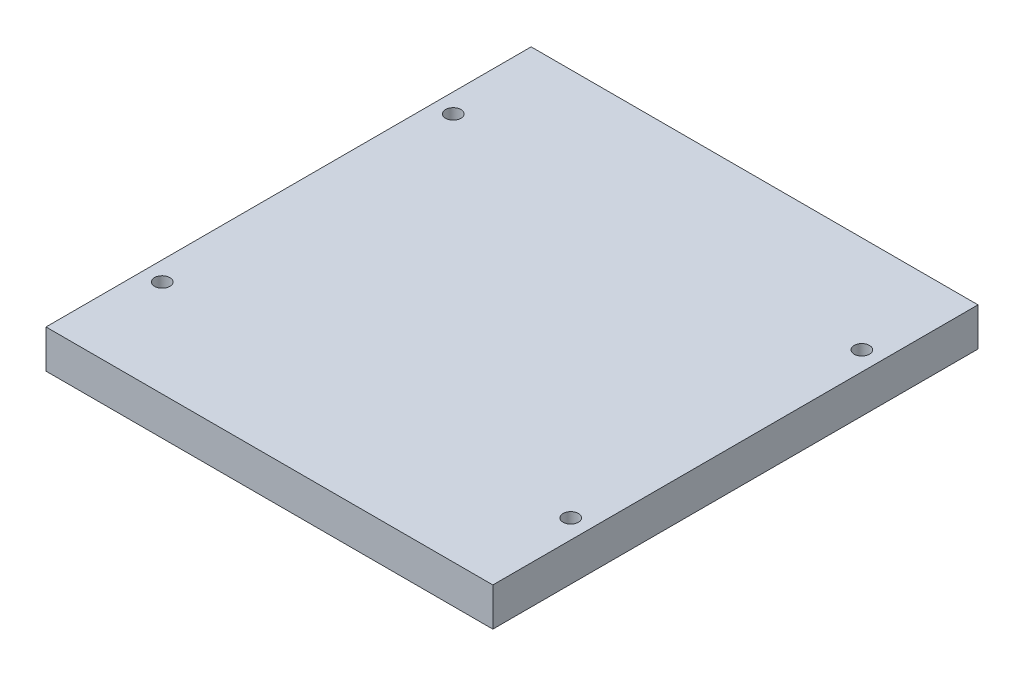
ISO-10303-21;
HEADER;
FILE_DESCRIPTION(('STEP AP214'),'2;1');
FILE_NAME('part.step','',(''),(''),'','','');
FILE_SCHEMA(('AUTOMOTIVE_DESIGN { 1 0 10303 214 1 1 1 1 }'));
ENDSEC;
DATA;
#1=APPLICATION_CONTEXT('core data for automotive mechanical design processes');
#2=APPLICATION_PROTOCOL_DEFINITION('international standard','automotive_design',2000,#1);
#3=PRODUCT_CONTEXT('',#1,'mechanical');
#4=PRODUCT('Part','Part','',(#3));
#5=PRODUCT_RELATED_PRODUCT_CATEGORY('part','',(#4));
#6=PRODUCT_DEFINITION_FORMATION('','',#4);
#7=PRODUCT_DEFINITION_CONTEXT('part definition',#1,'design');
#8=PRODUCT_DEFINITION('design','',#6,#7);
#9=PRODUCT_DEFINITION_SHAPE('','',#8);
#10=(LENGTH_UNIT() NAMED_UNIT(*) SI_UNIT(.MILLI.,.METRE.));
#11=(NAMED_UNIT(*) PLANE_ANGLE_UNIT() SI_UNIT($,.RADIAN.));
#12=(NAMED_UNIT(*) SI_UNIT($,.STERADIAN.) SOLID_ANGLE_UNIT());
#13=UNCERTAINTY_MEASURE_WITH_UNIT(LENGTH_MEASURE(1.E-05),#10,'distance_accuracy_value','');
#14=(GEOMETRIC_REPRESENTATION_CONTEXT(3) GLOBAL_UNCERTAINTY_ASSIGNED_CONTEXT((#13)) GLOBAL_UNIT_ASSIGNED_CONTEXT((#10,
#11,#12)) REPRESENTATION_CONTEXT('',''));
#15=CARTESIAN_POINT('',(0.,0.,0.));
#16=DIRECTION('',(0.,0.,1.));
#17=DIRECTION('',(1.,0.,0.));
#18=AXIS2_PLACEMENT_3D('',#15,#16,#17);
#19=CARTESIAN_POINT('',(16.,3.,-11.4));
#20=DIRECTION('',(0.,-1.,0.));
#21=DIRECTION('',(0.,0.,-1.));
#22=AXIS2_PLACEMENT_3D('',#19,#20,#21);
#23=CYLINDRICAL_SURFACE('',#22,0.6);
#24=CARTESIAN_POINT('',(16.,3.,-11.4));
#25=DIRECTION('',(0.,-1.,0.));
#26=DIRECTION('',(0.,0.,-1.));
#27=AXIS2_PLACEMENT_3D('',#24,#25,#26);
#28=CIRCLE('',#27,0.6);
#29=CARTESIAN_POINT('',(16.,3.,-12.));
#30=VERTEX_POINT('',#29);
#31=EDGE_CURVE('E112',#30,#30,#28,.T.);
#32=ORIENTED_EDGE('',*,*,#31,.F.);
#33=EDGE_LOOP('',(#32));
#34=FACE_BOUND('',#33,.T.);
#35=CARTESIAN_POINT('',(16.,1.5,-11.4));
#36=DIRECTION('',(0.,-1.,0.));
#37=DIRECTION('',(0.,0.,-1.));
#38=AXIS2_PLACEMENT_3D('',#35,#36,#37);
#39=CIRCLE('',#38,0.6);
#40=CARTESIAN_POINT('',(16.,1.5,-12.));
#41=VERTEX_POINT('',#40);
#42=EDGE_CURVE('E43',#41,#41,#39,.F.);
#43=ORIENTED_EDGE('',*,*,#42,.F.);
#44=EDGE_LOOP('',(#43));
#45=FACE_BOUND('',#44,.T.);
#46=ADVANCED_FACE('F39',(#34,#45),#23,.F.);
#47=CARTESIAN_POINT('',(16.,3.,11.4));
#48=DIRECTION('',(0.,-1.,0.));
#49=DIRECTION('',(0.,0.,-1.));
#50=AXIS2_PLACEMENT_3D('',#47,#48,#49);
#51=CYLINDRICAL_SURFACE('',#50,0.6);
#52=CARTESIAN_POINT('',(16.,3.,11.4));
#53=DIRECTION('',(0.,-1.,0.));
#54=DIRECTION('',(0.,0.,-1.));
#55=AXIS2_PLACEMENT_3D('',#52,#53,#54);
#56=CIRCLE('',#55,0.6);
#57=CARTESIAN_POINT('',(16.,3.,10.8));
#58=VERTEX_POINT('',#57);
#59=EDGE_CURVE('E138',#58,#58,#56,.T.);
#60=ORIENTED_EDGE('',*,*,#59,.F.);
#61=EDGE_LOOP('',(#60));
#62=FACE_BOUND('',#61,.T.);
#63=CARTESIAN_POINT('',(16.,1.5,11.4));
#64=DIRECTION('',(0.,-1.,0.));
#65=DIRECTION('',(0.,0.,-1.));
#66=AXIS2_PLACEMENT_3D('',#63,#64,#65);
#67=CIRCLE('',#66,0.6);
#68=CARTESIAN_POINT('',(16.,1.5,10.8));
#69=VERTEX_POINT('',#68);
#70=EDGE_CURVE('E124',#69,#69,#67,.F.);
#71=ORIENTED_EDGE('',*,*,#70,.F.);
#72=EDGE_LOOP('',(#71));
#73=FACE_BOUND('',#72,.T.);
#74=ADVANCED_FACE('F194',(#62,#73),#51,.F.);
#75=CARTESIAN_POINT('',(-16.,3.,11.4));
#76=DIRECTION('',(0.,-1.,0.));
#77=DIRECTION('',(0.,0.,-1.));
#78=AXIS2_PLACEMENT_3D('',#75,#76,#77);
#79=CYLINDRICAL_SURFACE('',#78,0.6);
#80=CARTESIAN_POINT('',(-16.,3.,11.4));
#81=DIRECTION('',(0.,-1.,0.));
#82=DIRECTION('',(0.,0.,-1.));
#83=AXIS2_PLACEMENT_3D('',#80,#81,#82);
#84=CIRCLE('',#83,0.6);
#85=CARTESIAN_POINT('',(-16.,3.,10.8));
#86=VERTEX_POINT('',#85);
#87=EDGE_CURVE('E133',#86,#86,#84,.T.);
#88=ORIENTED_EDGE('',*,*,#87,.F.);
#89=EDGE_LOOP('',(#88));
#90=FACE_BOUND('',#89,.T.);
#91=CARTESIAN_POINT('',(-16.,1.5,11.4));
#92=DIRECTION('',(0.,-1.,0.));
#93=DIRECTION('',(0.,0.,-1.));
#94=AXIS2_PLACEMENT_3D('',#91,#92,#93);
#95=CIRCLE('',#94,0.6);
#96=CARTESIAN_POINT('',(-16.,1.5,10.8));
#97=VERTEX_POINT('',#96);
#98=EDGE_CURVE('E121',#97,#97,#95,.F.);
#99=ORIENTED_EDGE('',*,*,#98,.F.);
#100=EDGE_LOOP('',(#99));
#101=FACE_BOUND('',#100,.T.);
#102=ADVANCED_FACE('F190',(#90,#101),#79,.F.);
#103=CARTESIAN_POINT('',(-16.,3.,-11.4));
#104=DIRECTION('',(0.,-1.,0.));
#105=DIRECTION('',(0.,0.,-1.));
#106=AXIS2_PLACEMENT_3D('',#103,#104,#105);
#107=CYLINDRICAL_SURFACE('',#106,0.6);
#108=CARTESIAN_POINT('',(-16.,3.,-11.4));
#109=DIRECTION('',(0.,-1.,0.));
#110=DIRECTION('',(0.,0.,-1.));
#111=AXIS2_PLACEMENT_3D('',#108,#109,#110);
#112=CIRCLE('',#111,0.6);
#113=CARTESIAN_POINT('',(-16.,3.,-12.));
#114=VERTEX_POINT('',#113);
#115=EDGE_CURVE('E129',#114,#114,#112,.T.);
#116=ORIENTED_EDGE('',*,*,#115,.F.);
#117=EDGE_LOOP('',(#116));
#118=FACE_BOUND('',#117,.T.);
#119=CARTESIAN_POINT('',(-16.,1.5,-11.4));
#120=DIRECTION('',(0.,-1.,0.));
#121=DIRECTION('',(0.,0.,-1.));
#122=AXIS2_PLACEMENT_3D('',#119,#120,#121);
#123=CIRCLE('',#122,0.6);
#124=CARTESIAN_POINT('',(-16.,1.5,-12.));
#125=VERTEX_POINT('',#124);
#126=EDGE_CURVE('E118',#125,#125,#123,.F.);
#127=ORIENTED_EDGE('',*,*,#126,.F.);
#128=EDGE_LOOP('',(#127));
#129=FACE_BOUND('',#128,.T.);
#130=ADVANCED_FACE('F184',(#118,#129),#107,.F.);
#131=CARTESIAN_POINT('',(-17.5,3.,19.));
#132=DIRECTION('',(-1.,0.,0.));
#133=DIRECTION('',(0.,0.,1.));
#134=AXIS2_PLACEMENT_3D('',#131,#132,#133);
#135=PLANE('',#134);
#136=DIRECTION('',(0.,0.,-1.));
#137=VECTOR('',#136,1.);
#138=CARTESIAN_POINT('',(-17.5,0.,19.));
#139=LINE('',#138,#137);
#140=CARTESIAN_POINT('',(-17.5,0.,19.));
#141=VERTEX_POINT('',#140);
#142=CARTESIAN_POINT('',(-17.5,0.,-19.));
#143=VERTEX_POINT('',#142);
#144=EDGE_CURVE('E108',#141,#143,#139,.T.);
#145=ORIENTED_EDGE('',*,*,#144,.F.);
#146=DIRECTION('',(0.,-1.,0.));
#147=VECTOR('',#146,1.);
#148=CARTESIAN_POINT('',(-17.5,3.,19.));
#149=LINE('',#148,#147);
#150=CARTESIAN_POINT('',(-17.5,3.,19.));
#151=VERTEX_POINT('',#150);
#152=EDGE_CURVE('E11',#151,#141,#149,.T.);
#153=ORIENTED_EDGE('',*,*,#152,.F.);
#154=DIRECTION('',(0.,0.,-1.));
#155=VECTOR('',#154,1.);
#156=CARTESIAN_POINT('',(-17.5,3.,19.));
#157=LINE('',#156,#155);
#158=CARTESIAN_POINT('',(-17.5,3.,-19.));
#159=VERTEX_POINT('',#158);
#160=EDGE_CURVE('E102',#151,#159,#157,.T.);
#161=ORIENTED_EDGE('',*,*,#160,.T.);
#162=DIRECTION('',(0.,-1.,0.));
#163=VECTOR('',#162,1.);
#164=CARTESIAN_POINT('',(-17.5,3.,-19.));
#165=LINE('',#164,#163);
#166=EDGE_CURVE('E81',#159,#143,#165,.T.);
#167=ORIENTED_EDGE('',*,*,#166,.T.);
#168=EDGE_LOOP('',(#145,#153,#161,#167));
#169=FACE_BOUND('',#168,.T.);
#170=ADVANCED_FACE('F41',(#169),#135,.T.);
#171=CARTESIAN_POINT('',(-17.5,3.,19.));
#172=DIRECTION('',(0.,0.,-1.));
#173=DIRECTION('',(-1.,0.,0.));
#174=AXIS2_PLACEMENT_3D('',#171,#172,#173);
#175=PLANE('',#174);
#176=DIRECTION('',(1.,0.,0.));
#177=VECTOR('',#176,1.);
#178=CARTESIAN_POINT('',(-17.5,0.,19.));
#179=LINE('',#178,#177);
#180=CARTESIAN_POINT('',(17.5,0.,19.));
#181=VERTEX_POINT('',#180);
#182=EDGE_CURVE('E73',#141,#181,#179,.T.);
#183=ORIENTED_EDGE('',*,*,#182,.T.);
#184=DIRECTION('',(0.,-1.,0.));
#185=VECTOR('',#184,1.);
#186=CARTESIAN_POINT('',(17.5,3.,19.));
#187=LINE('',#186,#185);
#188=CARTESIAN_POINT('',(17.5,3.,19.));
#189=VERTEX_POINT('',#188);
#190=EDGE_CURVE('E49',#189,#181,#187,.T.);
#191=ORIENTED_EDGE('',*,*,#190,.F.);
#192=DIRECTION('',(1.,0.,0.));
#193=VECTOR('',#192,1.);
#194=CARTESIAN_POINT('',(-17.5,3.,19.));
#195=LINE('',#194,#193);
#196=EDGE_CURVE('E91',#151,#189,#195,.T.);
#197=ORIENTED_EDGE('',*,*,#196,.F.);
#198=ORIENTED_EDGE('',*,*,#152,.T.);
#199=EDGE_LOOP('',(#183,#191,#197,#198));
#200=FACE_BOUND('',#199,.T.);
#201=ADVANCED_FACE('F183',(#200),#175,.F.);
#202=CARTESIAN_POINT('',(17.5,3.,19.));
#203=DIRECTION('',(-1.,0.,0.));
#204=DIRECTION('',(0.,0.,1.));
#205=AXIS2_PLACEMENT_3D('',#202,#203,#204);
#206=PLANE('',#205);
#207=DIRECTION('',(0.,0.,-1.));
#208=VECTOR('',#207,1.);
#209=CARTESIAN_POINT('',(17.5,0.,19.));
#210=LINE('',#209,#208);
#211=CARTESIAN_POINT('',(17.5,0.,-19.));
#212=VERTEX_POINT('',#211);
#213=EDGE_CURVE('E98',#181,#212,#210,.T.);
#214=ORIENTED_EDGE('',*,*,#213,.T.);
#215=DIRECTION('',(0.,-1.,0.));
#216=VECTOR('',#215,1.);
#217=CARTESIAN_POINT('',(17.5,3.,-19.));
#218=LINE('',#217,#216);
#219=CARTESIAN_POINT('',(17.5,3.,-19.));
#220=VERTEX_POINT('',#219);
#221=EDGE_CURVE('E95',#220,#212,#218,.T.);
#222=ORIENTED_EDGE('',*,*,#221,.F.);
#223=DIRECTION('',(0.,0.,-1.));
#224=VECTOR('',#223,1.);
#225=CARTESIAN_POINT('',(17.5,3.,19.));
#226=LINE('',#225,#224);
#227=EDGE_CURVE('E86',#189,#220,#226,.T.);
#228=ORIENTED_EDGE('',*,*,#227,.F.);
#229=ORIENTED_EDGE('',*,*,#190,.T.);
#230=EDGE_LOOP('',(#214,#222,#228,#229));
#231=FACE_BOUND('',#230,.T.);
#232=ADVANCED_FACE('F96',(#231),#206,.F.);
#233=CARTESIAN_POINT('',(-17.5,3.,-19.));
#234=DIRECTION('',(0.,0.,-1.));
#235=DIRECTION('',(-1.,0.,0.));
#236=AXIS2_PLACEMENT_3D('',#233,#234,#235);
#237=PLANE('',#236);
#238=DIRECTION('',(1.,0.,0.));
#239=VECTOR('',#238,1.);
#240=CARTESIAN_POINT('',(-17.5,0.,-19.));
#241=LINE('',#240,#239);
#242=EDGE_CURVE('E111',#143,#212,#241,.T.);
#243=ORIENTED_EDGE('',*,*,#242,.F.);
#244=ORIENTED_EDGE('',*,*,#166,.F.);
#245=DIRECTION('',(1.,0.,0.));
#246=VECTOR('',#245,1.);
#247=CARTESIAN_POINT('',(-17.5,3.,-19.));
#248=LINE('',#247,#246);
#249=EDGE_CURVE('E90',#159,#220,#248,.T.);
#250=ORIENTED_EDGE('',*,*,#249,.T.);
#251=ORIENTED_EDGE('',*,*,#221,.T.);
#252=EDGE_LOOP('',(#243,#244,#250,#251));
#253=FACE_BOUND('',#252,.T.);
#254=ADVANCED_FACE('F101',(#253),#237,.T.);
#255=CARTESIAN_POINT('',(0.,3.,0.));
#256=DIRECTION('',(0.,-1.,0.));
#257=DIRECTION('',(0.,0.,-1.));
#258=AXIS2_PLACEMENT_3D('',#255,#256,#257);
#259=PLANE('',#258);
#260=ORIENTED_EDGE('',*,*,#115,.T.);
#261=EDGE_LOOP('',(#260));
#262=FACE_BOUND('',#261,.T.);
#263=ORIENTED_EDGE('',*,*,#87,.T.);
#264=EDGE_LOOP('',(#263));
#265=FACE_BOUND('',#264,.T.);
#266=ORIENTED_EDGE('',*,*,#59,.T.);
#267=EDGE_LOOP('',(#266));
#268=FACE_BOUND('',#267,.T.);
#269=ORIENTED_EDGE('',*,*,#31,.T.);
#270=EDGE_LOOP('',(#269));
#271=FACE_BOUND('',#270,.T.);
#272=ORIENTED_EDGE('',*,*,#160,.F.);
#273=ORIENTED_EDGE('',*,*,#196,.T.);
#274=ORIENTED_EDGE('',*,*,#227,.T.);
#275=ORIENTED_EDGE('',*,*,#249,.F.);
#276=EDGE_LOOP('',(#272,#273,#274,#275));
#277=FACE_BOUND('',#276,.T.);
#278=ADVANCED_FACE('F89',(#262,#265,#268,#271,#277),#259,.F.);
#279=CARTESIAN_POINT('',(0.,0.,0.));
#280=DIRECTION('',(0.,-1.,0.));
#281=DIRECTION('',(0.,0.,-1.));
#282=AXIS2_PLACEMENT_3D('',#279,#280,#281);
#283=PLANE('',#282);
#284=CARTESIAN_POINT('',(16.,0.,11.4));
#285=DIRECTION('',(0.,-1.,0.));
#286=DIRECTION('',(0.,0.,-1.));
#287=AXIS2_PLACEMENT_3D('',#284,#285,#286);
#288=CIRCLE('',#287,1.00000000000001);
#289=CARTESIAN_POINT('',(16.,0.,10.4));
#290=VERTEX_POINT('',#289);
#291=EDGE_CURVE('E151',#290,#290,#288,.T.);
#292=ORIENTED_EDGE('',*,*,#291,.F.);
#293=EDGE_LOOP('',(#292));
#294=FACE_BOUND('',#293,.T.);
#295=CARTESIAN_POINT('',(-16.,0.,-11.4));
#296=DIRECTION('',(0.,-1.,0.));
#297=DIRECTION('',(0.,0.,-1.));
#298=AXIS2_PLACEMENT_3D('',#295,#296,#297);
#299=CIRCLE('',#298,1.);
#300=CARTESIAN_POINT('',(-16.,0.,-12.4));
#301=VERTEX_POINT('',#300);
#302=EDGE_CURVE('E157',#301,#301,#299,.T.);
#303=ORIENTED_EDGE('',*,*,#302,.F.);
#304=EDGE_LOOP('',(#303));
#305=FACE_BOUND('',#304,.T.);
#306=CARTESIAN_POINT('',(-16.,0.,11.4));
#307=DIRECTION('',(0.,-1.,0.));
#308=DIRECTION('',(0.,0.,-1.));
#309=AXIS2_PLACEMENT_3D('',#306,#307,#308);
#310=CIRCLE('',#309,1.);
#311=CARTESIAN_POINT('',(-16.,0.,10.4));
#312=VERTEX_POINT('',#311);
#313=EDGE_CURVE('E158',#312,#312,#310,.T.);
#314=ORIENTED_EDGE('',*,*,#313,.F.);
#315=EDGE_LOOP('',(#314));
#316=FACE_BOUND('',#315,.T.);
#317=CARTESIAN_POINT('',(16.,0.,-11.4));
#318=DIRECTION('',(0.,-1.,0.));
#319=DIRECTION('',(0.,0.,-1.));
#320=AXIS2_PLACEMENT_3D('',#317,#318,#319);
#321=CIRCLE('',#320,1.);
#322=CARTESIAN_POINT('',(16.,0.,-12.4));
#323=VERTEX_POINT('',#322);
#324=EDGE_CURVE('E148',#323,#323,#321,.T.);
#325=ORIENTED_EDGE('',*,*,#324,.F.);
#326=EDGE_LOOP('',(#325));
#327=FACE_BOUND('',#326,.T.);
#328=ORIENTED_EDGE('',*,*,#144,.T.);
#329=ORIENTED_EDGE('',*,*,#242,.T.);
#330=ORIENTED_EDGE('',*,*,#213,.F.);
#331=ORIENTED_EDGE('',*,*,#182,.F.);
#332=EDGE_LOOP('',(#328,#329,#330,#331));
#333=FACE_BOUND('',#332,.T.);
#334=ADVANCED_FACE('F174',(#294,#305,#316,#327,#333),#283,.T.);
#335=CARTESIAN_POINT('',(-16.,1.5,-11.4));
#336=DIRECTION('',(0.,-1.,0.));
#337=DIRECTION('',(0.,0.,-1.));
#338=AXIS2_PLACEMENT_3D('',#335,#336,#337);
#339=PLANE('',#338);
#340=CARTESIAN_POINT('',(-16.,1.5,-11.4));
#341=DIRECTION('',(0.,-1.,0.));
#342=DIRECTION('',(0.,0.,-1.));
#343=AXIS2_PLACEMENT_3D('',#340,#341,#342);
#344=CIRCLE('',#343,1.);
#345=CARTESIAN_POINT('',(-16.,1.5,-12.4));
#346=VERTEX_POINT('',#345);
#347=EDGE_CURVE('E154',#346,#346,#344,.T.);
#348=ORIENTED_EDGE('',*,*,#347,.T.);
#349=EDGE_LOOP('',(#348));
#350=FACE_BOUND('',#349,.T.);
#351=ORIENTED_EDGE('',*,*,#126,.T.);
#352=EDGE_LOOP('',(#351));
#353=FACE_BOUND('',#352,.T.);
#354=ADVANCED_FACE('F177',(#350,#353),#339,.T.);
#355=CARTESIAN_POINT('',(-16.,1.5,-11.4));
#356=DIRECTION('',(0.,-1.,0.));
#357=DIRECTION('',(0.,0.,-1.));
#358=AXIS2_PLACEMENT_3D('',#355,#356,#357);
#359=CYLINDRICAL_SURFACE('',#358,1.);
#360=ORIENTED_EDGE('',*,*,#347,.F.);
#361=EDGE_LOOP('',(#360));
#362=FACE_BOUND('',#361,.T.);
#363=ORIENTED_EDGE('',*,*,#302,.T.);
#364=EDGE_LOOP('',(#363));
#365=FACE_BOUND('',#364,.T.);
#366=ADVANCED_FACE('F239',(#362,#365),#359,.F.);
#367=CARTESIAN_POINT('',(-16.,1.5,11.4));
#368=DIRECTION('',(0.,-1.,0.));
#369=DIRECTION('',(0.,0.,-1.));
#370=AXIS2_PLACEMENT_3D('',#367,#368,#369);
#371=PLANE('',#370);
#372=CARTESIAN_POINT('',(-16.,1.5,11.4));
#373=DIRECTION('',(0.,-1.,0.));
#374=DIRECTION('',(0.,0.,-1.));
#375=AXIS2_PLACEMENT_3D('',#372,#373,#374);
#376=CIRCLE('',#375,1.);
#377=CARTESIAN_POINT('',(-16.,1.5,10.4));
#378=VERTEX_POINT('',#377);
#379=EDGE_CURVE('E166',#378,#378,#376,.T.);
#380=ORIENTED_EDGE('',*,*,#379,.T.);
#381=EDGE_LOOP('',(#380));
#382=FACE_BOUND('',#381,.T.);
#383=ORIENTED_EDGE('',*,*,#98,.T.);
#384=EDGE_LOOP('',(#383));
#385=FACE_BOUND('',#384,.T.);
#386=ADVANCED_FACE('F251',(#382,#385),#371,.T.);
#387=CARTESIAN_POINT('',(-16.,1.5,11.4));
#388=DIRECTION('',(0.,-1.,0.));
#389=DIRECTION('',(0.,0.,-1.));
#390=AXIS2_PLACEMENT_3D('',#387,#388,#389);
#391=CYLINDRICAL_SURFACE('',#390,1.);
#392=ORIENTED_EDGE('',*,*,#379,.F.);
#393=EDGE_LOOP('',(#392));
#394=FACE_BOUND('',#393,.T.);
#395=ORIENTED_EDGE('',*,*,#313,.T.);
#396=EDGE_LOOP('',(#395));
#397=FACE_BOUND('',#396,.T.);
#398=ADVANCED_FACE('F172',(#394,#397),#391,.F.);
#399=CARTESIAN_POINT('',(16.,1.5,11.4));
#400=DIRECTION('',(0.,-1.,0.));
#401=DIRECTION('',(0.,0.,-1.));
#402=AXIS2_PLACEMENT_3D('',#399,#400,#401);
#403=PLANE('',#402);
#404=CARTESIAN_POINT('',(16.,1.5,11.4));
#405=DIRECTION('',(0.,-1.,0.));
#406=DIRECTION('',(0.,0.,-1.));
#407=AXIS2_PLACEMENT_3D('',#404,#405,#406);
#408=CIRCLE('',#407,1.00000000000001);
#409=CARTESIAN_POINT('',(16.,1.5,10.4));
#410=VERTEX_POINT('',#409);
#411=EDGE_CURVE('E161',#410,#410,#408,.T.);
#412=ORIENTED_EDGE('',*,*,#411,.T.);
#413=EDGE_LOOP('',(#412));
#414=FACE_BOUND('',#413,.T.);
#415=ORIENTED_EDGE('',*,*,#70,.T.);
#416=EDGE_LOOP('',(#415));
#417=FACE_BOUND('',#416,.T.);
#418=ADVANCED_FACE('F272',(#414,#417),#403,.T.);
#419=CARTESIAN_POINT('',(16.,1.5,11.4));
#420=DIRECTION('',(0.,-1.,0.));
#421=DIRECTION('',(0.,0.,-1.));
#422=AXIS2_PLACEMENT_3D('',#419,#420,#421);
#423=CYLINDRICAL_SURFACE('',#422,1.00000000000001);
#424=ORIENTED_EDGE('',*,*,#411,.F.);
#425=EDGE_LOOP('',(#424));
#426=FACE_BOUND('',#425,.T.);
#427=ORIENTED_EDGE('',*,*,#291,.T.);
#428=EDGE_LOOP('',(#427));
#429=FACE_BOUND('',#428,.T.);
#430=ADVANCED_FACE('F283',(#426,#429),#423,.F.);
#431=CARTESIAN_POINT('',(16.,1.5,-11.4));
#432=DIRECTION('',(0.,-1.,0.));
#433=DIRECTION('',(0.,0.,-1.));
#434=AXIS2_PLACEMENT_3D('',#431,#432,#433);
#435=PLANE('',#434);
#436=CARTESIAN_POINT('',(16.,1.5,-11.4));
#437=DIRECTION('',(0.,-1.,0.));
#438=DIRECTION('',(0.,0.,-1.));
#439=AXIS2_PLACEMENT_3D('',#436,#437,#438);
#440=CIRCLE('',#439,1.);
#441=CARTESIAN_POINT('',(16.,1.5,-12.4));
#442=VERTEX_POINT('',#441);
#443=EDGE_CURVE('E122',#442,#442,#440,.T.);
#444=ORIENTED_EDGE('',*,*,#443,.T.);
#445=EDGE_LOOP('',(#444));
#446=FACE_BOUND('',#445,.T.);
#447=ORIENTED_EDGE('',*,*,#42,.T.);
#448=EDGE_LOOP('',(#447));
#449=FACE_BOUND('',#448,.T.);
#450=ADVANCED_FACE('F294',(#446,#449),#435,.T.);
#451=CARTESIAN_POINT('',(16.,1.5,-11.4));
#452=DIRECTION('',(0.,-1.,0.));
#453=DIRECTION('',(0.,0.,-1.));
#454=AXIS2_PLACEMENT_3D('',#451,#452,#453);
#455=CYLINDRICAL_SURFACE('',#454,1.);
#456=ORIENTED_EDGE('',*,*,#443,.F.);
#457=EDGE_LOOP('',(#456));
#458=FACE_BOUND('',#457,.T.);
#459=ORIENTED_EDGE('',*,*,#324,.T.);
#460=EDGE_LOOP('',(#459));
#461=FACE_BOUND('',#460,.T.);
#462=ADVANCED_FACE('F305',(#458,#461),#455,.F.);
#463=CLOSED_SHELL('',(#46,#74,#102,#130,#170,#201,#232,#254,#278,#334,#354,#366,#386,#398,#418,
#430,#450,#462));
#464=MANIFOLD_SOLID_BREP('B2',#463);
#465=ADVANCED_BREP_SHAPE_REPRESENTATION('',(#18,#464),#14);
#466=SHAPE_DEFINITION_REPRESENTATION(#9,#465);
ENDSEC;
END-ISO-10303-21;
